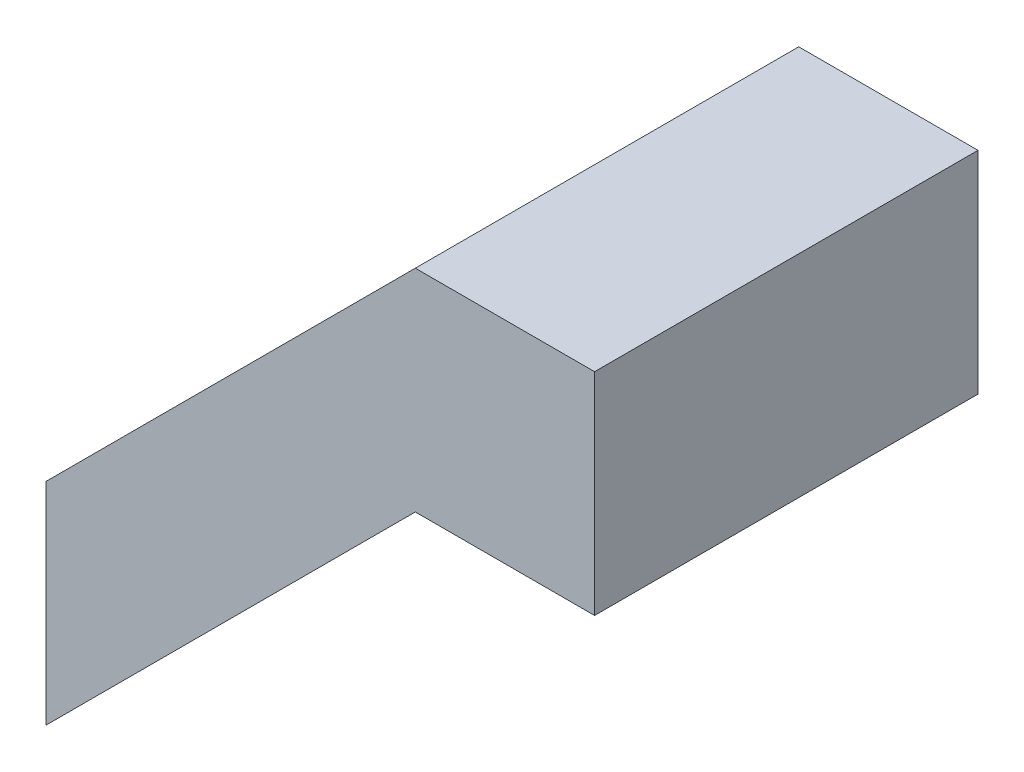
ISO-10303-21;
HEADER;
FILE_DESCRIPTION(('STEP AP214'),'2;1');
FILE_NAME('part.step','',(''),(''),'','','');
FILE_SCHEMA(('AUTOMOTIVE_DESIGN { 1 0 10303 214 1 1 1 1 }'));
ENDSEC;
DATA;
#1=APPLICATION_CONTEXT('core data for automotive mechanical design processes');
#2=APPLICATION_PROTOCOL_DEFINITION('international standard','automotive_design',2000,#1);
#3=PRODUCT_CONTEXT('',#1,'mechanical');
#4=PRODUCT('Part','Part','',(#3));
#5=PRODUCT_RELATED_PRODUCT_CATEGORY('part','',(#4));
#6=PRODUCT_DEFINITION_FORMATION('','',#4);
#7=PRODUCT_DEFINITION_CONTEXT('part definition',#1,'design');
#8=PRODUCT_DEFINITION('design','',#6,#7);
#9=PRODUCT_DEFINITION_SHAPE('','',#8);
#10=(LENGTH_UNIT() NAMED_UNIT(*) SI_UNIT(.MILLI.,.METRE.));
#11=(NAMED_UNIT(*) PLANE_ANGLE_UNIT() SI_UNIT($,.RADIAN.));
#12=(NAMED_UNIT(*) SI_UNIT($,.STERADIAN.) SOLID_ANGLE_UNIT());
#13=UNCERTAINTY_MEASURE_WITH_UNIT(LENGTH_MEASURE(1.E-05),#10,'distance_accuracy_value','');
#14=(GEOMETRIC_REPRESENTATION_CONTEXT(3) GLOBAL_UNCERTAINTY_ASSIGNED_CONTEXT((#13)) GLOBAL_UNIT_ASSIGNED_CONTEXT((#10,
#11,#12)) REPRESENTATION_CONTEXT('',''));
#15=CARTESIAN_POINT('',(0.,0.,0.));
#16=DIRECTION('',(0.,0.,1.));
#17=DIRECTION('',(1.,0.,0.));
#18=AXIS2_PLACEMENT_3D('',#15,#16,#17);
#19=CARTESIAN_POINT('',(119.254539470003,-58.7452355299967,-9.08));
#20=DIRECTION('',(-1.,0.,0.));
#21=DIRECTION('',(0.,0.,1.));
#22=AXIS2_PLACEMENT_3D('',#19,#20,#21);
#23=PLANE('',#22);
#24=DIRECTION('',(0.,-1.,0.));
#25=VECTOR('',#24,1.);
#26=CARTESIAN_POINT('',(119.254539470003,-56.2452355299967,-5.));
#27=LINE('',#26,#25);
#28=CARTESIAN_POINT('',(119.254539470003,-56.2452355299967,-5.));
#29=VERTEX_POINT('',#28);
#30=CARTESIAN_POINT('',(119.254539470003,-58.7452355299967,-5.));
#31=VERTEX_POINT('',#30);
#32=EDGE_CURVE('E114',#29,#31,#27,.T.);
#33=ORIENTED_EDGE('',*,*,#32,.T.);
#34=DIRECTION('',(0.,0.,1.));
#35=VECTOR('',#34,1.);
#36=CARTESIAN_POINT('',(119.254539470003,-58.7452355299967,-9.08));
#37=LINE('',#36,#35);
#38=CARTESIAN_POINT('',(119.254539470003,-58.7452355299967,-1.5));
#39=VERTEX_POINT('',#38);
#40=EDGE_CURVE('E42',#31,#39,#37,.T.);
#41=ORIENTED_EDGE('',*,*,#40,.T.);
#42=DIRECTION('',(0.,1.,0.));
#43=VECTOR('',#42,1.);
#44=CARTESIAN_POINT('',(119.254539470003,-56.2452355299967,-1.5));
#45=LINE('',#44,#43);
#46=CARTESIAN_POINT('',(119.254539470003,-56.2452355299967,-1.5));
#47=VERTEX_POINT('',#46);
#48=EDGE_CURVE('E112',#39,#47,#45,.T.);
#49=ORIENTED_EDGE('',*,*,#48,.T.);
#50=DIRECTION('',(0.,0.,1.));
#51=VECTOR('',#50,1.);
#52=CARTESIAN_POINT('',(119.254539470003,-56.2452355299967,-9.08));
#53=LINE('',#52,#51);
#54=EDGE_CURVE('E119',#29,#47,#53,.T.);
#55=ORIENTED_EDGE('',*,*,#54,.F.);
#56=EDGE_LOOP('',(#33,#41,#49,#55));
#57=FACE_BOUND('',#56,.T.);
#58=ADVANCED_FACE('F33',(#57),#23,.T.);
#59=CARTESIAN_POINT('',(119.254539470003,-56.2452355299967,-9.08));
#60=DIRECTION('',(0.707106781186547,-0.707106781186547,0.));
#61=DIRECTION('',(0.707106781186548,0.707106781186548,0.));
#62=AXIS2_PLACEMENT_3D('',#59,#60,#61);
#63=PLANE('',#62);
#64=DIRECTION('',(0.707106781186547,0.707106781186547,0.));
#65=VECTOR('',#64,1.);
#66=CARTESIAN_POINT('',(119.254539470003,-56.2452355299967,-5.));
#67=LINE('',#66,#65);
#68=CARTESIAN_POINT('',(115.254539470003,-60.2452355299967,-5.));
#69=VERTEX_POINT('',#68);
#70=EDGE_CURVE('E50',#69,#29,#67,.T.);
#71=ORIENTED_EDGE('',*,*,#70,.T.);
#72=ORIENTED_EDGE('',*,*,#54,.T.);
#73=DIRECTION('',(-0.707106781186547,-0.707106781186547,0.));
#74=VECTOR('',#73,1.);
#75=CARTESIAN_POINT('',(115.254539470003,-60.2452355299967,-1.5));
#76=LINE('',#75,#74);
#77=CARTESIAN_POINT('',(115.254539470003,-60.2452355299967,-1.5));
#78=VERTEX_POINT('',#77);
#79=EDGE_CURVE('E129',#47,#78,#76,.T.);
#80=ORIENTED_EDGE('',*,*,#79,.T.);
#81=DIRECTION('',(0.,0.,1.));
#82=VECTOR('',#81,1.);
#83=CARTESIAN_POINT('',(115.254539470003,-60.2452355299967,-9.08));
#84=LINE('',#83,#82);
#85=EDGE_CURVE('E178',#69,#78,#84,.T.);
#86=ORIENTED_EDGE('',*,*,#85,.F.);
#87=EDGE_LOOP('',(#71,#72,#80,#86));
#88=FACE_BOUND('',#87,.T.);
#89=ADVANCED_FACE('F221',(#88),#63,.T.);
#90=CARTESIAN_POINT('',(115.254539470003,-62.7452355299967,-9.08));
#91=DIRECTION('',(1.,0.,0.));
#92=DIRECTION('',(0.,0.,-1.));
#93=AXIS2_PLACEMENT_3D('',#90,#91,#92);
#94=PLANE('',#93);
#95=DIRECTION('',(0.,1.,0.));
#96=VECTOR('',#95,1.);
#97=CARTESIAN_POINT('',(115.254539470003,-60.2452355299967,-5.));
#98=LINE('',#97,#96);
#99=CARTESIAN_POINT('',(115.254539470003,-62.7452355299967,-5.));
#100=VERTEX_POINT('',#99);
#101=EDGE_CURVE('E58',#100,#69,#98,.T.);
#102=ORIENTED_EDGE('',*,*,#101,.T.);
#103=ORIENTED_EDGE('',*,*,#85,.T.);
#104=DIRECTION('',(0.,-1.,0.));
#105=VECTOR('',#104,1.);
#106=CARTESIAN_POINT('',(115.254539470003,-60.2452355299967,-1.5));
#107=LINE('',#106,#105);
#108=CARTESIAN_POINT('',(115.254539470003,-62.7452355299967,-1.5));
#109=VERTEX_POINT('',#108);
#110=EDGE_CURVE('E140',#78,#109,#107,.T.);
#111=ORIENTED_EDGE('',*,*,#110,.T.);
#112=DIRECTION('',(0.,0.,1.));
#113=VECTOR('',#112,1.);
#114=CARTESIAN_POINT('',(115.254539470003,-62.7452355299967,-9.08));
#115=LINE('',#114,#113);
#116=EDGE_CURVE('E133',#100,#109,#115,.T.);
#117=ORIENTED_EDGE('',*,*,#116,.F.);
#118=EDGE_LOOP('',(#102,#103,#111,#117));
#119=FACE_BOUND('',#118,.T.);
#120=ADVANCED_FACE('F226',(#119),#94,.T.);
#121=CARTESIAN_POINT('',(126.245140529997,-55.999935,-9.08));
#122=DIRECTION('',(0.,-1.,0.));
#123=DIRECTION('',(0.,0.,-1.));
#124=AXIS2_PLACEMENT_3D('',#121,#122,#123);
#125=PLANE('',#124);
#126=DIRECTION('',(1.,0.,0.));
#127=VECTOR('',#126,1.);
#128=CARTESIAN_POINT('',(126.245140529997,-55.999935,0.));
#129=LINE('',#128,#127);
#130=CARTESIAN_POINT('',(121.99984,-55.999935,0.));
#131=VERTEX_POINT('',#130);
#132=CARTESIAN_POINT('',(126.245140529997,-55.999935,0.));
#133=VERTEX_POINT('',#132);
#134=EDGE_CURVE('E142',#131,#133,#129,.T.);
#135=ORIENTED_EDGE('',*,*,#134,.F.);
#136=DIRECTION('',(0.,0.,1.));
#137=VECTOR('',#136,1.);
#138=CARTESIAN_POINT('',(121.99984,-55.999935,-9.08));
#139=LINE('',#138,#137);
#140=CARTESIAN_POINT('',(121.99984,-55.999935,-9.08));
#141=VERTEX_POINT('',#140);
#142=EDGE_CURVE('E11',#141,#131,#139,.T.);
#143=ORIENTED_EDGE('',*,*,#142,.F.);
#144=DIRECTION('',(1.,0.,0.));
#145=VECTOR('',#144,1.);
#146=CARTESIAN_POINT('',(126.245140529997,-55.999935,-9.08));
#147=LINE('',#146,#145);
#148=CARTESIAN_POINT('',(126.245140529997,-55.999935,-9.08));
#149=VERTEX_POINT('',#148);
#150=EDGE_CURVE('E143',#141,#149,#147,.T.);
#151=ORIENTED_EDGE('',*,*,#150,.T.);
#152=DIRECTION('',(0.,0.,1.));
#153=VECTOR('',#152,1.);
#154=CARTESIAN_POINT('',(126.245140529997,-55.999935,-9.08));
#155=LINE('',#154,#153);
#156=EDGE_CURVE('E37',#149,#133,#155,.T.);
#157=ORIENTED_EDGE('',*,*,#156,.T.);
#158=EDGE_LOOP('',(#135,#143,#151,#157));
#159=FACE_BOUND('',#158,.T.);
#160=ADVANCED_FACE('F35',(#159),#125,.T.);
#161=CARTESIAN_POINT('',(121.99984,-55.999935,-9.08));
#162=DIRECTION('',(0.707106781186547,-0.707106781186547,0.));
#163=DIRECTION('',(0.707106781186548,0.707106781186548,0.));
#164=AXIS2_PLACEMENT_3D('',#161,#162,#163);
#165=PLANE('',#164);
#166=DIRECTION('',(-0.707106781186547,-0.707106781186547,0.));
#167=VECTOR('',#166,1.);
#168=CARTESIAN_POINT('',(119.254539470003,-58.7452355299967,-5.));
#169=LINE('',#168,#167);
#170=EDGE_CURVE('E135',#31,#100,#169,.T.);
#171=ORIENTED_EDGE('',*,*,#170,.T.);
#172=ORIENTED_EDGE('',*,*,#116,.T.);
#173=DIRECTION('',(0.707106781186547,0.707106781186547,0.));
#174=VECTOR('',#173,1.);
#175=CARTESIAN_POINT('',(119.254539470003,-58.7452355299967,-1.5));
#176=LINE('',#175,#174);
#177=EDGE_CURVE('E126',#109,#39,#176,.T.);
#178=ORIENTED_EDGE('',*,*,#177,.T.);
#179=ORIENTED_EDGE('',*,*,#40,.F.);
#180=EDGE_LOOP('',(#171,#172,#178,#179));
#181=FACE_BOUND('',#180,.T.);
#182=DIRECTION('',(0.707106781186547,0.707106781186547,0.));
#183=VECTOR('',#182,1.);
#184=CARTESIAN_POINT('',(121.99984,-55.999935,0.));
#185=LINE('',#184,#183);
#186=CARTESIAN_POINT('',(113.254539470003,-64.7452355299967,0.));
#187=VERTEX_POINT('',#186);
#188=EDGE_CURVE('E147',#187,#131,#185,.T.);
#189=ORIENTED_EDGE('',*,*,#188,.F.);
#190=DIRECTION('',(0.,0.,1.));
#191=VECTOR('',#190,1.);
#192=CARTESIAN_POINT('',(113.254539470003,-64.7452355299967,-9.08));
#193=LINE('',#192,#191);
#194=CARTESIAN_POINT('',(113.254539470003,-64.7452355299967,-9.08));
#195=VERTEX_POINT('',#194);
#196=EDGE_CURVE('E181',#195,#187,#193,.T.);
#197=ORIENTED_EDGE('',*,*,#196,.F.);
#198=DIRECTION('',(0.707106781186547,0.707106781186547,0.));
#199=VECTOR('',#198,1.);
#200=CARTESIAN_POINT('',(113.254539470003,-64.7452355299967,-9.08));
#201=LINE('',#200,#199);
#202=EDGE_CURVE('E159',#195,#141,#201,.T.);
#203=ORIENTED_EDGE('',*,*,#202,.T.);
#204=ORIENTED_EDGE('',*,*,#142,.T.);
#205=EDGE_LOOP('',(#189,#197,#203,#204));
#206=FACE_BOUND('',#205,.T.);
#207=ADVANCED_FACE('F131',(#181,#206),#165,.T.);
#208=CARTESIAN_POINT('',(113.254539470003,-64.7452355299967,-9.08));
#209=DIRECTION('',(-1.,0.,0.));
#210=DIRECTION('',(0.,0.,1.));
#211=AXIS2_PLACEMENT_3D('',#208,#209,#210);
#212=PLANE('',#211);
#213=DIRECTION('',(0.,-1.,0.));
#214=VECTOR('',#213,1.);
#215=CARTESIAN_POINT('',(113.254539470003,-64.7452355299967,0.));
#216=LINE('',#215,#214);
#217=CARTESIAN_POINT('',(113.254539470003,-59.7452355299967,0.));
#218=VERTEX_POINT('',#217);
#219=EDGE_CURVE('E172',#218,#187,#216,.T.);
#220=ORIENTED_EDGE('',*,*,#219,.F.);
#221=DIRECTION('',(0.,0.,1.));
#222=VECTOR('',#221,1.);
#223=CARTESIAN_POINT('',(113.254539470003,-59.7452355299967,-9.08));
#224=LINE('',#223,#222);
#225=CARTESIAN_POINT('',(113.254539470003,-59.7452355299967,-9.08));
#226=VERTEX_POINT('',#225);
#227=EDGE_CURVE('E184',#226,#218,#224,.T.);
#228=ORIENTED_EDGE('',*,*,#227,.F.);
#229=DIRECTION('',(0.,-1.,0.));
#230=VECTOR('',#229,1.);
#231=CARTESIAN_POINT('',(113.254539470003,-64.7452355299967,-9.08));
#232=LINE('',#231,#230);
#233=EDGE_CURVE('E156',#226,#195,#232,.T.);
#234=ORIENTED_EDGE('',*,*,#233,.T.);
#235=ORIENTED_EDGE('',*,*,#196,.T.);
#236=EDGE_LOOP('',(#220,#228,#234,#235));
#237=FACE_BOUND('',#236,.T.);
#238=ADVANCED_FACE('F202',(#237),#212,.T.);
#239=CARTESIAN_POINT('',(121.99984,-50.999935,-9.08));
#240=DIRECTION('',(-0.707106781186547,0.707106781186547,0.));
#241=DIRECTION('',(-0.707106781186548,-0.707106781186548,0.));
#242=AXIS2_PLACEMENT_3D('',#239,#240,#241);
#243=PLANE('',#242);
#244=DIRECTION('',(-0.707106781186548,-0.707106781186548,0.));
#245=VECTOR('',#244,1.);
#246=CARTESIAN_POINT('',(121.99984,-50.999935,0.));
#247=LINE('',#246,#245);
#248=CARTESIAN_POINT('',(121.99984,-50.999935,0.));
#249=VERTEX_POINT('',#248);
#250=EDGE_CURVE('E169',#249,#218,#247,.T.);
#251=ORIENTED_EDGE('',*,*,#250,.F.);
#252=DIRECTION('',(0.,0.,1.));
#253=VECTOR('',#252,1.);
#254=CARTESIAN_POINT('',(121.99984,-50.999935,-9.08));
#255=LINE('',#254,#253);
#256=CARTESIAN_POINT('',(121.99984,-50.999935,-9.08));
#257=VERTEX_POINT('',#256);
#258=EDGE_CURVE('E186',#257,#249,#255,.T.);
#259=ORIENTED_EDGE('',*,*,#258,.F.);
#260=DIRECTION('',(-0.707106781186548,-0.707106781186548,0.));
#261=VECTOR('',#260,1.);
#262=CARTESIAN_POINT('',(121.99984,-50.999935,-9.08));
#263=LINE('',#262,#261);
#264=EDGE_CURVE('E153',#257,#226,#263,.T.);
#265=ORIENTED_EDGE('',*,*,#264,.T.);
#266=ORIENTED_EDGE('',*,*,#227,.T.);
#267=EDGE_LOOP('',(#251,#259,#265,#266));
#268=FACE_BOUND('',#267,.T.);
#269=ADVANCED_FACE('F210',(#268),#243,.T.);
#270=CARTESIAN_POINT('',(126.245140529997,-50.999935,-9.08));
#271=DIRECTION('',(0.,1.,0.));
#272=DIRECTION('',(0.,0.,1.));
#273=AXIS2_PLACEMENT_3D('',#270,#271,#272);
#274=PLANE('',#273);
#275=DIRECTION('',(-1.,0.,0.));
#276=VECTOR('',#275,1.);
#277=CARTESIAN_POINT('',(126.245140529997,-50.999935,0.));
#278=LINE('',#277,#276);
#279=CARTESIAN_POINT('',(126.245140529997,-50.999935,0.));
#280=VERTEX_POINT('',#279);
#281=EDGE_CURVE('E166',#280,#249,#278,.T.);
#282=ORIENTED_EDGE('',*,*,#281,.F.);
#283=DIRECTION('',(0.,0.,1.));
#284=VECTOR('',#283,1.);
#285=CARTESIAN_POINT('',(126.245140529997,-50.999935,-9.08));
#286=LINE('',#285,#284);
#287=CARTESIAN_POINT('',(126.245140529997,-50.999935,-9.08));
#288=VERTEX_POINT('',#287);
#289=EDGE_CURVE('E187',#288,#280,#286,.T.);
#290=ORIENTED_EDGE('',*,*,#289,.F.);
#291=DIRECTION('',(-1.,0.,0.));
#292=VECTOR('',#291,1.);
#293=CARTESIAN_POINT('',(126.245140529997,-50.999935,-9.08));
#294=LINE('',#293,#292);
#295=EDGE_CURVE('E150',#288,#257,#294,.T.);
#296=ORIENTED_EDGE('',*,*,#295,.T.);
#297=ORIENTED_EDGE('',*,*,#258,.T.);
#298=EDGE_LOOP('',(#282,#290,#296,#297));
#299=FACE_BOUND('',#298,.T.);
#300=ADVANCED_FACE('F212',(#299),#274,.T.);
#301=CARTESIAN_POINT('',(126.245140529997,-55.999935,-9.08));
#302=DIRECTION('',(1.,0.,0.));
#303=DIRECTION('',(0.,0.,-1.));
#304=AXIS2_PLACEMENT_3D('',#301,#302,#303);
#305=PLANE('',#304);
#306=DIRECTION('',(0.,1.,0.));
#307=VECTOR('',#306,1.);
#308=CARTESIAN_POINT('',(126.245140529997,-55.999935,0.));
#309=LINE('',#308,#307);
#310=EDGE_CURVE('E163',#133,#280,#309,.T.);
#311=ORIENTED_EDGE('',*,*,#310,.F.);
#312=ORIENTED_EDGE('',*,*,#156,.F.);
#313=DIRECTION('',(0.,1.,0.));
#314=VECTOR('',#313,1.);
#315=CARTESIAN_POINT('',(126.245140529997,-55.999935,-9.08));
#316=LINE('',#315,#314);
#317=EDGE_CURVE('E146',#149,#288,#316,.T.);
#318=ORIENTED_EDGE('',*,*,#317,.T.);
#319=ORIENTED_EDGE('',*,*,#289,.T.);
#320=EDGE_LOOP('',(#311,#312,#318,#319));
#321=FACE_BOUND('',#320,.T.);
#322=ADVANCED_FACE('F196',(#321),#305,.T.);
#323=CARTESIAN_POINT('',(0.,0.,-9.08));
#324=DIRECTION('',(0.,0.,-1.));
#325=DIRECTION('',(-1.,0.,0.));
#326=AXIS2_PLACEMENT_3D('',#323,#324,#325);
#327=PLANE('',#326);
#328=ORIENTED_EDGE('',*,*,#150,.F.);
#329=ORIENTED_EDGE('',*,*,#202,.F.);
#330=ORIENTED_EDGE('',*,*,#233,.F.);
#331=ORIENTED_EDGE('',*,*,#264,.F.);
#332=ORIENTED_EDGE('',*,*,#295,.F.);
#333=ORIENTED_EDGE('',*,*,#317,.F.);
#334=EDGE_LOOP('',(#328,#329,#330,#331,#332,#333));
#335=FACE_BOUND('',#334,.T.);
#336=ADVANCED_FACE('F206',(#335),#327,.T.);
#337=CARTESIAN_POINT('',(0.,0.,0.));
#338=DIRECTION('',(0.,0.,-1.));
#339=DIRECTION('',(-1.,0.,0.));
#340=AXIS2_PLACEMENT_3D('',#337,#338,#339);
#341=PLANE('',#340);
#342=ORIENTED_EDGE('',*,*,#134,.T.);
#343=ORIENTED_EDGE('',*,*,#310,.T.);
#344=ORIENTED_EDGE('',*,*,#281,.T.);
#345=ORIENTED_EDGE('',*,*,#250,.T.);
#346=ORIENTED_EDGE('',*,*,#219,.T.);
#347=ORIENTED_EDGE('',*,*,#188,.T.);
#348=EDGE_LOOP('',(#342,#343,#344,#345,#346,#347));
#349=FACE_BOUND('',#348,.T.);
#350=ADVANCED_FACE('F198',(#349),#341,.F.);
#351=CARTESIAN_POINT('',(0.,0.,-1.5));
#352=DIRECTION('',(0.,0.,1.));
#353=DIRECTION('',(1.,0.,0.));
#354=AXIS2_PLACEMENT_3D('',#351,#352,#353);
#355=PLANE('',#354);
#356=ORIENTED_EDGE('',*,*,#177,.F.);
#357=ORIENTED_EDGE('',*,*,#110,.F.);
#358=ORIENTED_EDGE('',*,*,#79,.F.);
#359=ORIENTED_EDGE('',*,*,#48,.F.);
#360=EDGE_LOOP('',(#356,#357,#358,#359));
#361=FACE_BOUND('',#360,.T.);
#362=ADVANCED_FACE('F124',(#361),#355,.F.);
#363=CARTESIAN_POINT('',(0.,0.,-5.));
#364=DIRECTION('',(0.,0.,1.));
#365=DIRECTION('',(1.,0.,0.));
#366=AXIS2_PLACEMENT_3D('',#363,#364,#365);
#367=PLANE('',#366);
#368=ORIENTED_EDGE('',*,*,#70,.F.);
#369=ORIENTED_EDGE('',*,*,#101,.F.);
#370=ORIENTED_EDGE('',*,*,#170,.F.);
#371=ORIENTED_EDGE('',*,*,#32,.F.);
#372=EDGE_LOOP('',(#368,#369,#370,#371));
#373=FACE_BOUND('',#372,.T.);
#374=ADVANCED_FACE('F264',(#373),#367,.T.);
#375=CLOSED_SHELL('',(#58,#89,#120,#160,#207,#238,#269,#300,#322,#336,#350,#362,#374));
#376=MANIFOLD_SOLID_BREP('B2',#375);
#377=ADVANCED_BREP_SHAPE_REPRESENTATION('',(#18,#376),#14);
#378=SHAPE_DEFINITION_REPRESENTATION(#9,#377);
ENDSEC;
END-ISO-10303-21;
